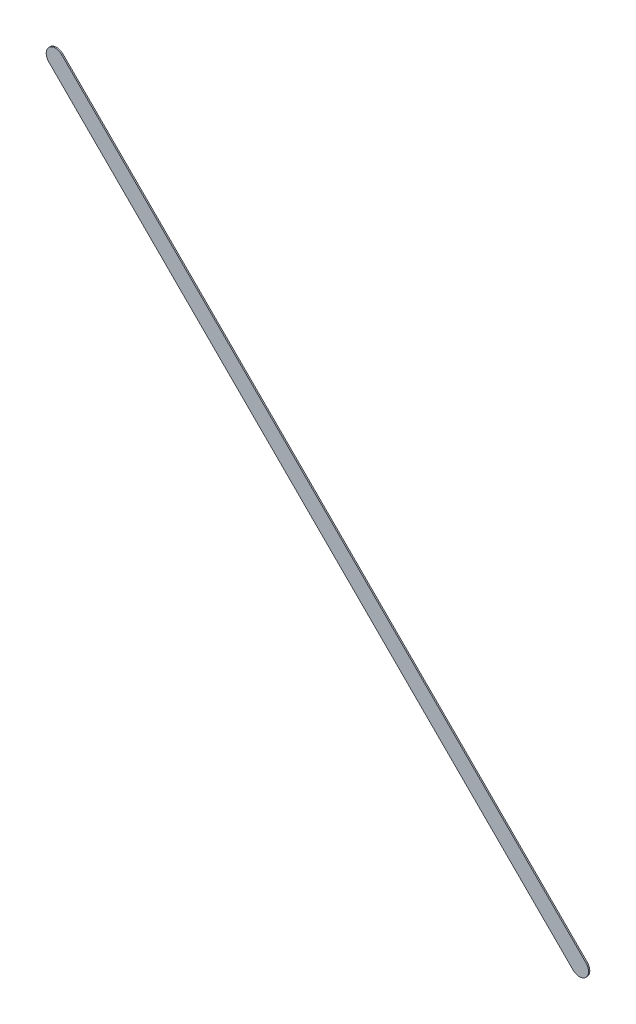
ISO-10303-21;
HEADER;
FILE_DESCRIPTION(('STEP AP214'),'2;1');
FILE_NAME('part.step','',(''),(''),'','','');
FILE_SCHEMA(('AUTOMOTIVE_DESIGN { 1 0 10303 214 1 1 1 1 }'));
ENDSEC;
DATA;
#1=APPLICATION_CONTEXT('core data for automotive mechanical design processes');
#2=APPLICATION_PROTOCOL_DEFINITION('international standard','automotive_design',2000,#1);
#3=PRODUCT_CONTEXT('',#1,'mechanical');
#4=PRODUCT('Part','Part','',(#3));
#5=PRODUCT_RELATED_PRODUCT_CATEGORY('part','',(#4));
#6=PRODUCT_DEFINITION_FORMATION('','',#4);
#7=PRODUCT_DEFINITION_CONTEXT('part definition',#1,'design');
#8=PRODUCT_DEFINITION('design','',#6,#7);
#9=PRODUCT_DEFINITION_SHAPE('','',#8);
#10=(LENGTH_UNIT() NAMED_UNIT(*) SI_UNIT(.MILLI.,.METRE.));
#11=(NAMED_UNIT(*) PLANE_ANGLE_UNIT() SI_UNIT($,.RADIAN.));
#12=(NAMED_UNIT(*) SI_UNIT($,.STERADIAN.) SOLID_ANGLE_UNIT());
#13=UNCERTAINTY_MEASURE_WITH_UNIT(LENGTH_MEASURE(1.E-05),#10,'distance_accuracy_value','');
#14=(GEOMETRIC_REPRESENTATION_CONTEXT(3) GLOBAL_UNCERTAINTY_ASSIGNED_CONTEXT((#13)) GLOBAL_UNIT_ASSIGNED_CONTEXT((#10,
#11,#12)) REPRESENTATION_CONTEXT('',''));
#15=CARTESIAN_POINT('',(0.,0.,0.));
#16=DIRECTION('',(0.,0.,1.));
#17=DIRECTION('',(1.,0.,0.));
#18=AXIS2_PLACEMENT_3D('',#15,#16,#17);
#19=CARTESIAN_POINT('',(62.22322328,107.32322452,0.));
#20=DIRECTION('',(0.707106781186548,0.707106781186548,0.));
#21=DIRECTION('',(0.707106781186548,-0.707106781186548,0.));
#22=AXIS2_PLACEMENT_3D('',#19,#20,#21);
#23=PLANE('',#22);
#24=DIRECTION('',(0.707106781186548,-0.707106781186548,0.));
#25=VECTOR('',#24,1.);
#26=CARTESIAN_POINT('',(62.22322328,107.32322452,0.03556));
#27=LINE('',#26,#25);
#28=CARTESIAN_POINT('',(62.22322328,107.32322452,0.03556));
#29=VERTEX_POINT('',#28);
#30=CARTESIAN_POINT('',(76.72322476,92.82322304,0.03556));
#31=VERTEX_POINT('',#30);
#32=EDGE_CURVE('E11',#29,#31,#27,.T.);
#33=ORIENTED_EDGE('',*,*,#32,.F.);
#34=DIRECTION('',(0.,0.,1.));
#35=VECTOR('',#34,1.);
#36=CARTESIAN_POINT('',(62.22322328,107.32322452,0.));
#37=LINE('',#36,#35);
#38=CARTESIAN_POINT('',(62.22322328,107.32322452,0.));
#39=VERTEX_POINT('',#38);
#40=EDGE_CURVE('E24',#39,#29,#37,.T.);
#41=ORIENTED_EDGE('',*,*,#40,.F.);
#42=DIRECTION('',(0.707106781186548,-0.707106781186548,0.));
#43=VECTOR('',#42,1.);
#44=CARTESIAN_POINT('',(62.22322328,107.32322452,0.));
#45=LINE('',#44,#43);
#46=CARTESIAN_POINT('',(76.72322476,92.82322304,0.));
#47=VERTEX_POINT('',#46);
#48=EDGE_CURVE('E75',#39,#47,#45,.T.);
#49=ORIENTED_EDGE('',*,*,#48,.T.);
#50=DIRECTION('',(0.,0.,1.));
#51=VECTOR('',#50,1.);
#52=CARTESIAN_POINT('',(76.72322476,92.82322304,0.));
#53=LINE('',#52,#51);
#54=EDGE_CURVE('E37',#47,#31,#53,.T.);
#55=ORIENTED_EDGE('',*,*,#54,.T.);
#56=EDGE_LOOP('',(#33,#41,#49,#55));
#57=FACE_BOUND('',#56,.T.);
#58=ADVANCED_FACE('F17',(#57),#23,.F.);
#59=CARTESIAN_POINT('',(76.90000114,92.99999942,0.));
#60=DIRECTION('',(0.,0.,-1.));
#61=DIRECTION('',(-0.707106781186576,-0.707106781186519,0.));
#62=AXIS2_PLACEMENT_3D('',#59,#60,#61);
#63=CYLINDRICAL_SURFACE('',#62,0.249999554103213);
#64=CARTESIAN_POINT('',(76.90000114,92.99999942,0.03556));
#65=DIRECTION('',(0.,0.,1.));
#66=DIRECTION('',(-0.707106781186576,-0.707106781186519,0.));
#67=AXIS2_PLACEMENT_3D('',#64,#65,#66);
#68=CIRCLE('',#67,0.249999554103213);
#69=CARTESIAN_POINT('',(77.07677752,93.1767758,0.03556));
#70=VERTEX_POINT('',#69);
#71=EDGE_CURVE('E83',#31,#70,#68,.T.);
#72=ORIENTED_EDGE('',*,*,#71,.F.);
#73=ORIENTED_EDGE('',*,*,#54,.F.);
#74=CARTESIAN_POINT('',(76.90000114,92.99999942,0.));
#75=DIRECTION('',(0.,0.,1.));
#76=DIRECTION('',(-0.707106781186576,-0.707106781186519,0.));
#77=AXIS2_PLACEMENT_3D('',#74,#75,#76);
#78=CIRCLE('',#77,0.249999554103213);
#79=CARTESIAN_POINT('',(77.07677752,93.1767758,0.));
#80=VERTEX_POINT('',#79);
#81=EDGE_CURVE('E81',#47,#80,#78,.T.);
#82=ORIENTED_EDGE('',*,*,#81,.T.);
#83=DIRECTION('',(0.,0.,1.));
#84=VECTOR('',#83,1.);
#85=CARTESIAN_POINT('',(77.07677752,93.1767758,0.));
#86=LINE('',#85,#84);
#87=EDGE_CURVE('E67',#80,#70,#86,.T.);
#88=ORIENTED_EDGE('',*,*,#87,.T.);
#89=EDGE_LOOP('',(#72,#73,#82,#88));
#90=FACE_BOUND('',#89,.T.);
#91=ADVANCED_FACE('F89',(#90),#63,.T.);
#92=CARTESIAN_POINT('',(77.07677752,93.1767758,0.));
#93=DIRECTION('',(-0.707106781186548,-0.707106781186547,0.));
#94=DIRECTION('',(-0.707106781186547,0.707106781186548,0.));
#95=AXIS2_PLACEMENT_3D('',#92,#93,#94);
#96=PLANE('',#95);
#97=DIRECTION('',(-0.707106781186547,0.707106781186548,0.));
#98=VECTOR('',#97,1.);
#99=CARTESIAN_POINT('',(77.07677752,93.1767758,0.03556));
#100=LINE('',#99,#98);
#101=CARTESIAN_POINT('',(62.57677604,107.67677728,0.03556));
#102=VERTEX_POINT('',#101);
#103=EDGE_CURVE('E71',#70,#102,#100,.T.);
#104=ORIENTED_EDGE('',*,*,#103,.F.);
#105=ORIENTED_EDGE('',*,*,#87,.F.);
#106=DIRECTION('',(-0.707106781186547,0.707106781186548,0.));
#107=VECTOR('',#106,1.);
#108=CARTESIAN_POINT('',(77.07677752,93.1767758,0.));
#109=LINE('',#108,#107);
#110=CARTESIAN_POINT('',(62.57677604,107.67677728,0.));
#111=VERTEX_POINT('',#110);
#112=EDGE_CURVE('E63',#80,#111,#109,.T.);
#113=ORIENTED_EDGE('',*,*,#112,.T.);
#114=DIRECTION('',(0.,0.,1.));
#115=VECTOR('',#114,1.);
#116=CARTESIAN_POINT('',(62.57677604,107.67677728,0.));
#117=LINE('',#116,#115);
#118=EDGE_CURVE('E53',#111,#102,#117,.T.);
#119=ORIENTED_EDGE('',*,*,#118,.T.);
#120=EDGE_LOOP('',(#104,#105,#113,#119));
#121=FACE_BOUND('',#120,.T.);
#122=ADVANCED_FACE('F66',(#121),#96,.F.);
#123=CARTESIAN_POINT('',(62.39999966,107.5000009,0.));
#124=DIRECTION('',(0.,0.,-1.));
#125=DIRECTION('',(0.707106781186562,0.707106781186533,0.));
#126=AXIS2_PLACEMENT_3D('',#123,#124,#125);
#127=CYLINDRICAL_SURFACE('',#126,0.249999554103221);
#128=CARTESIAN_POINT('',(62.39999966,107.5000009,0.03556));
#129=DIRECTION('',(0.,0.,1.));
#130=DIRECTION('',(0.707106781186562,0.707106781186533,0.));
#131=AXIS2_PLACEMENT_3D('',#128,#129,#130);
#132=CIRCLE('',#131,0.249999554103221);
#133=EDGE_CURVE('E59',#102,#29,#132,.T.);
#134=ORIENTED_EDGE('',*,*,#133,.F.);
#135=ORIENTED_EDGE('',*,*,#118,.F.);
#136=CARTESIAN_POINT('',(62.39999966,107.5000009,0.));
#137=DIRECTION('',(0.,0.,1.));
#138=DIRECTION('',(0.707106781186562,0.707106781186533,0.));
#139=AXIS2_PLACEMENT_3D('',#136,#137,#138);
#140=CIRCLE('',#139,0.249999554103221);
#141=EDGE_CURVE('E57',#111,#39,#140,.T.);
#142=ORIENTED_EDGE('',*,*,#141,.T.);
#143=ORIENTED_EDGE('',*,*,#40,.T.);
#144=EDGE_LOOP('',(#134,#135,#142,#143));
#145=FACE_BOUND('',#144,.T.);
#146=ADVANCED_FACE('F55',(#145),#127,.T.);
#147=CARTESIAN_POINT('',(62.22322328,107.32322452,0.));
#148=DIRECTION('',(0.,0.,-1.));
#149=DIRECTION('',(-1.,0.,0.));
#150=AXIS2_PLACEMENT_3D('',#147,#148,#149);
#151=PLANE('',#150);
#152=ORIENTED_EDGE('',*,*,#141,.F.);
#153=ORIENTED_EDGE('',*,*,#112,.F.);
#154=ORIENTED_EDGE('',*,*,#81,.F.);
#155=ORIENTED_EDGE('',*,*,#48,.F.);
#156=EDGE_LOOP('',(#152,#153,#154,#155));
#157=FACE_BOUND('',#156,.T.);
#158=ADVANCED_FACE('F74',(#157),#151,.T.);
#159=CARTESIAN_POINT('',(62.22322328,107.32322452,0.03556));
#160=DIRECTION('',(0.,0.,-1.));
#161=DIRECTION('',(-1.,0.,0.));
#162=AXIS2_PLACEMENT_3D('',#159,#160,#161);
#163=PLANE('',#162);
#164=ORIENTED_EDGE('',*,*,#32,.T.);
#165=ORIENTED_EDGE('',*,*,#71,.T.);
#166=ORIENTED_EDGE('',*,*,#103,.T.);
#167=ORIENTED_EDGE('',*,*,#133,.T.);
#168=EDGE_LOOP('',(#164,#165,#166,#167));
#169=FACE_BOUND('',#168,.T.);
#170=ADVANCED_FACE('F91',(#169),#163,.F.);
#171=CLOSED_SHELL('',(#58,#91,#122,#146,#158,#170));
#172=MANIFOLD_SOLID_BREP('B1',#171);
#173=ADVANCED_BREP_SHAPE_REPRESENTATION('',(#18,#172),#14);
#174=SHAPE_DEFINITION_REPRESENTATION(#9,#173);
ENDSEC;
END-ISO-10303-21;
